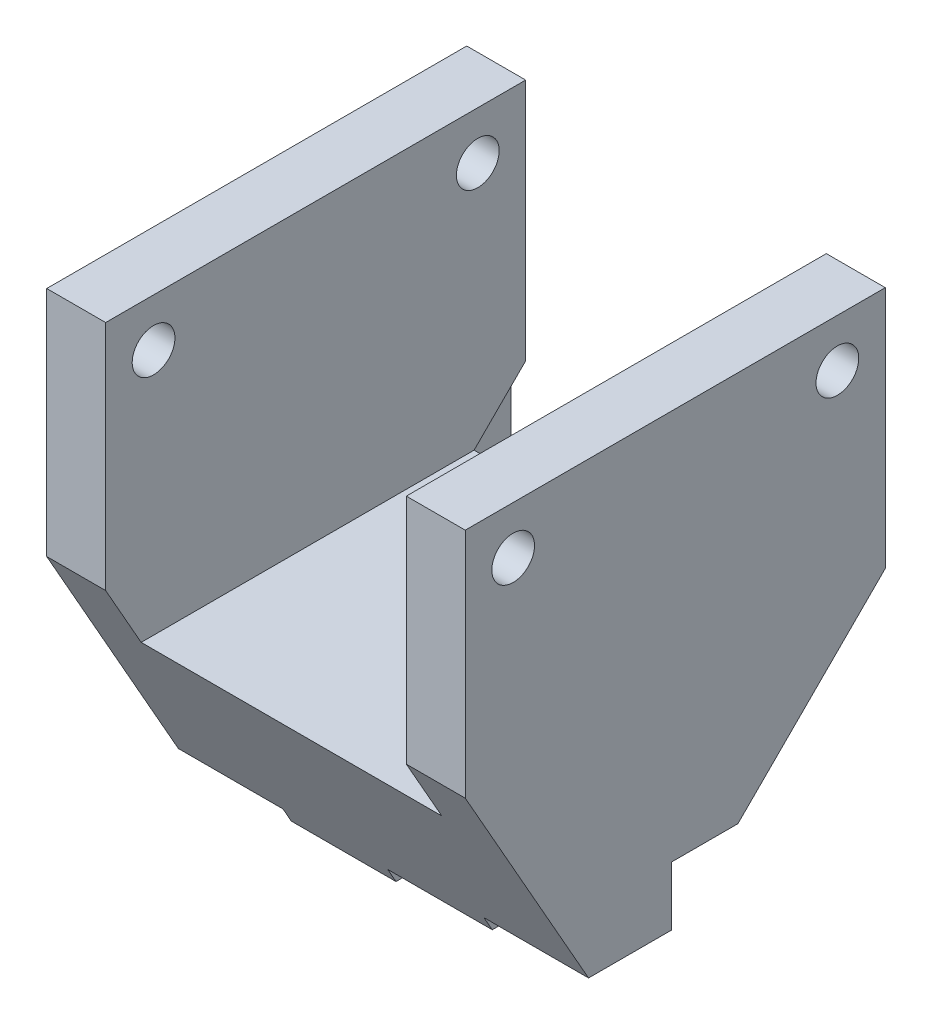
ISO-10303-21;
HEADER;
FILE_DESCRIPTION(('STEP AP214'),'2;1');
FILE_NAME('part.step','',(''),(''),'','','');
FILE_SCHEMA(('AUTOMOTIVE_DESIGN { 1 0 10303 214 1 1 1 1 }'));
ENDSEC;
DATA;
#1=APPLICATION_CONTEXT('core data for automotive mechanical design processes');
#2=APPLICATION_PROTOCOL_DEFINITION('international standard','automotive_design',2000,#1);
#3=PRODUCT_CONTEXT('',#1,'mechanical');
#4=PRODUCT('Part','Part','',(#3));
#5=PRODUCT_RELATED_PRODUCT_CATEGORY('part','',(#4));
#6=PRODUCT_DEFINITION_FORMATION('','',#4);
#7=PRODUCT_DEFINITION_CONTEXT('part definition',#1,'design');
#8=PRODUCT_DEFINITION('design','',#6,#7);
#9=PRODUCT_DEFINITION_SHAPE('','',#8);
#10=(LENGTH_UNIT() NAMED_UNIT(*) SI_UNIT(.MILLI.,.METRE.));
#11=(NAMED_UNIT(*) PLANE_ANGLE_UNIT() SI_UNIT($,.RADIAN.));
#12=(NAMED_UNIT(*) SI_UNIT($,.STERADIAN.) SOLID_ANGLE_UNIT());
#13=UNCERTAINTY_MEASURE_WITH_UNIT(LENGTH_MEASURE(1.E-05),#10,'distance_accuracy_value','');
#14=(GEOMETRIC_REPRESENTATION_CONTEXT(3) GLOBAL_UNCERTAINTY_ASSIGNED_CONTEXT((#13)) GLOBAL_UNIT_ASSIGNED_CONTEXT((#10,
#11,#12)) REPRESENTATION_CONTEXT('',''));
#15=CARTESIAN_POINT('',(0.,0.,0.));
#16=DIRECTION('',(0.,0.,1.));
#17=DIRECTION('',(1.,0.,0.));
#18=AXIS2_PLACEMENT_3D('',#15,#16,#17);
#19=CARTESIAN_POINT('',(64.,0.,0.));
#20=DIRECTION('',(0.,0.,1.));
#21=DIRECTION('',(-1.,0.,0.));
#22=AXIS2_PLACEMENT_3D('',#19,#20,#21);
#23=PLANE('',#22);
#24=DIRECTION('',(0.,1.,0.));
#25=VECTOR('',#24,1.);
#26=CARTESIAN_POINT('',(50.,4.74999999999999,0.));
#27=LINE('',#26,#25);
#28=CARTESIAN_POINT('',(50.,-7.25000000000001,0.));
#29=VERTEX_POINT('',#28);
#30=CARTESIAN_POINT('',(50.,6.75000000000007,0.));
#31=VERTEX_POINT('',#30);
#32=EDGE_CURVE('E470',#29,#31,#27,.T.);
#33=ORIENTED_EDGE('',*,*,#32,.F.);
#34=DIRECTION('',(-1.,0.,0.));
#35=VECTOR('',#34,1.);
#36=CARTESIAN_POINT('',(75.4,-7.25000000000001,0.));
#37=LINE('',#36,#35);
#38=CARTESIAN_POINT('',(47.,-7.25000000000001,0.));
#39=VERTEX_POINT('',#38);
#40=EDGE_CURVE('E259',#29,#39,#37,.T.);
#41=ORIENTED_EDGE('',*,*,#40,.T.);
#42=CARTESIAN_POINT('',(47.,-2.25000000000001,0.));
#43=DIRECTION('',(0.,0.,-1.));
#44=DIRECTION('',(-1.,0.,0.));
#45=AXIS2_PLACEMENT_3D('',#42,#43,#44);
#46=CIRCLE('',#45,5.);
#47=CARTESIAN_POINT('',(42.,-2.25000000000001,0.));
#48=VERTEX_POINT('',#47);
#49=EDGE_CURVE('E557',#48,#39,#46,.F.);
#50=ORIENTED_EDGE('',*,*,#49,.F.);
#51=DIRECTION('',(0.,1.,0.));
#52=VECTOR('',#51,1.);
#53=CARTESIAN_POINT('',(42.,4.74999999999999,0.));
#54=LINE('',#53,#52);
#55=CARTESIAN_POINT('',(42.,4.74999999999999,0.));
#56=VERTEX_POINT('',#55);
#57=EDGE_CURVE('E459',#48,#56,#54,.T.);
#58=ORIENTED_EDGE('',*,*,#57,.T.);
#59=DIRECTION('',(-1.,0.,0.));
#60=VECTOR('',#59,1.);
#61=CARTESIAN_POINT('',(50.,4.74999999999999,0.));
#62=LINE('',#61,#60);
#63=CARTESIAN_POINT('',(47.,4.75,0.));
#64=VERTEX_POINT('',#63);
#65=EDGE_CURVE('E473',#64,#56,#62,.T.);
#66=ORIENTED_EDGE('',*,*,#65,.F.);
#67=DIRECTION('',(0.,1.,0.));
#68=VECTOR('',#67,1.);
#69=CARTESIAN_POINT('',(47.,23.25,0.));
#70=LINE('',#69,#68);
#71=CARTESIAN_POINT('',(47.,23.25,0.));
#72=VERTEX_POINT('',#71);
#73=EDGE_CURVE('E520',#64,#72,#70,.T.);
#74=ORIENTED_EDGE('',*,*,#73,.T.);
#75=DIRECTION('',(1.,0.,0.));
#76=VECTOR('',#75,1.);
#77=CARTESIAN_POINT('',(81.,23.25,0.));
#78=LINE('',#77,#76);
#79=CARTESIAN_POINT('',(51.,23.25,0.));
#80=VERTEX_POINT('',#79);
#81=EDGE_CURVE('E526',#72,#80,#78,.T.);
#82=ORIENTED_EDGE('',*,*,#81,.T.);
#83=DIRECTION('',(0.,-1.,0.));
#84=VECTOR('',#83,1.);
#85=CARTESIAN_POINT('',(51.,23.25,0.));
#86=LINE('',#85,#84);
#87=CARTESIAN_POINT('',(51.,6.75000000000007,0.));
#88=VERTEX_POINT('',#87);
#89=EDGE_CURVE('E488',#80,#88,#86,.T.);
#90=ORIENTED_EDGE('',*,*,#89,.T.);
#91=DIRECTION('',(1.,0.,0.));
#92=VECTOR('',#91,1.);
#93=CARTESIAN_POINT('',(64.,6.75000000000006,0.));
#94=LINE('',#93,#92);
#95=EDGE_CURVE('E573',#31,#88,#94,.T.);
#96=ORIENTED_EDGE('',*,*,#95,.F.);
#97=EDGE_LOOP('',(#33,#41,#50,#58,#66,#74,#82,#90,#96));
#98=FACE_BOUND('',#97,.T.);
#99=ADVANCED_FACE('F49',(#98),#23,.F.);
#100=CARTESIAN_POINT('',(81.,-3.25000000000001,28.5));
#101=DIRECTION('',(0.,1.,0.));
#102=DIRECTION('',(1.,0.,0.));
#103=AXIS2_PLACEMENT_3D('',#100,#101,#102);
#104=PLANE('',#103);
#105=DIRECTION('',(0.,0.,-1.));
#106=VECTOR('',#105,1.);
#107=CARTESIAN_POINT('',(75.4,-3.25000000000001,28.5));
#108=LINE('',#107,#106);
#109=CARTESIAN_POINT('',(75.4,-3.25000000000001,14.5));
#110=VERTEX_POINT('',#109);
#111=CARTESIAN_POINT('',(75.4,-3.25000000000001,10.0000000000002));
#112=VERTEX_POINT('',#111);
#113=EDGE_CURVE('E420',#110,#112,#108,.T.);
#114=ORIENTED_EDGE('',*,*,#113,.F.);
#115=DIRECTION('',(-1.,0.,0.));
#116=VECTOR('',#115,1.);
#117=CARTESIAN_POINT('',(64.,-3.25000000000001,14.5));
#118=LINE('',#117,#116);
#119=CARTESIAN_POINT('',(68.3,-3.25000000000001,14.5));
#120=VERTEX_POINT('',#119);
#121=EDGE_CURVE('E358',#110,#120,#118,.T.);
#122=ORIENTED_EDGE('',*,*,#121,.T.);
#123=DIRECTION('',(0.,0.,-1.));
#124=VECTOR('',#123,1.);
#125=CARTESIAN_POINT('',(68.3,-3.25000000000001,0.));
#126=LINE('',#125,#124);
#127=CARTESIAN_POINT('',(68.3,-3.25000000000001,11.5));
#128=VERTEX_POINT('',#127);
#129=EDGE_CURVE('E374',#120,#128,#126,.T.);
#130=ORIENTED_EDGE('',*,*,#129,.T.);
#131=DIRECTION('',(-1.,0.,0.));
#132=VECTOR('',#131,1.);
#133=CARTESIAN_POINT('',(64.,-3.25000000000001,11.5));
#134=LINE('',#133,#132);
#135=CARTESIAN_POINT('',(61.2,-3.25000000000001,11.5));
#136=VERTEX_POINT('',#135);
#137=EDGE_CURVE('E378',#128,#136,#134,.T.);
#138=ORIENTED_EDGE('',*,*,#137,.T.);
#139=DIRECTION('',(0.,0.,-1.));
#140=VECTOR('',#139,1.);
#141=CARTESIAN_POINT('',(61.2,-3.25000000000001,0.));
#142=LINE('',#141,#140);
#143=CARTESIAN_POINT('',(61.2,-3.25000000000001,10.0000000000002));
#144=VERTEX_POINT('',#143);
#145=EDGE_CURVE('E382',#136,#144,#142,.T.);
#146=ORIENTED_EDGE('',*,*,#145,.T.);
#147=DIRECTION('',(-1.,0.,0.));
#148=VECTOR('',#147,1.);
#149=CARTESIAN_POINT('',(81.,-3.25000000000001,10.0000000000002));
#150=LINE('',#149,#148);
#151=EDGE_CURVE('E565',#112,#144,#150,.T.);
#152=ORIENTED_EDGE('',*,*,#151,.F.);
#153=EDGE_LOOP('',(#114,#122,#130,#138,#146,#152));
#154=FACE_BOUND('',#153,.T.);
#155=ADVANCED_FACE('F660',(#154),#104,.F.);
#156=CARTESIAN_POINT('',(64.,0.,28.5));
#157=DIRECTION('',(0.,0.,1.));
#158=DIRECTION('',(-1.,0.,0.));
#159=AXIS2_PLACEMENT_3D('',#156,#157,#158);
#160=PLANE('',#159);
#161=DIRECTION('',(-1.,0.,0.));
#162=VECTOR('',#161,1.);
#163=CARTESIAN_POINT('',(75.4,7.49999999999999,28.5));
#164=LINE('',#163,#162);
#165=CARTESIAN_POINT('',(51.,7.49999999999999,28.5));
#166=VERTEX_POINT('',#165);
#167=CARTESIAN_POINT('',(47.,7.49999999999999,28.5));
#168=VERTEX_POINT('',#167);
#169=EDGE_CURVE('E278',#166,#168,#164,.T.);
#170=ORIENTED_EDGE('',*,*,#169,.F.);
#171=DIRECTION('',(0.,-1.,0.));
#172=VECTOR('',#171,1.);
#173=CARTESIAN_POINT('',(51.,23.25,28.5));
#174=LINE('',#173,#172);
#175=CARTESIAN_POINT('',(51.,23.25,28.5));
#176=VERTEX_POINT('',#175);
#177=EDGE_CURVE('E489',#176,#166,#174,.T.);
#178=ORIENTED_EDGE('',*,*,#177,.F.);
#179=DIRECTION('',(1.,0.,0.));
#180=VECTOR('',#179,1.);
#181=CARTESIAN_POINT('',(81.,23.25,28.5));
#182=LINE('',#181,#180);
#183=CARTESIAN_POINT('',(47.,23.25,28.5));
#184=VERTEX_POINT('',#183);
#185=EDGE_CURVE('E527',#184,#176,#182,.T.);
#186=ORIENTED_EDGE('',*,*,#185,.F.);
#187=DIRECTION('',(0.,1.,0.));
#188=VECTOR('',#187,1.);
#189=CARTESIAN_POINT('',(47.,23.25,28.5));
#190=LINE('',#189,#188);
#191=EDGE_CURVE('E521',#168,#184,#190,.T.);
#192=ORIENTED_EDGE('',*,*,#191,.F.);
#193=EDGE_LOOP('',(#170,#178,#186,#192));
#194=FACE_BOUND('',#193,.T.);
#195=ADVANCED_FACE('F650',(#194),#160,.T.);
#196=CARTESIAN_POINT('',(54.1,-7.25000000000001,0.));
#197=DIRECTION('',(-1.,0.,0.));
#198=DIRECTION('',(0.,0.,-1.));
#199=AXIS2_PLACEMENT_3D('',#196,#197,#198);
#200=PLANE('',#199);
#201=DIRECTION('',(0.,0.869836501992695,0.493340105607797));
#202=VECTOR('',#201,1.);
#203=CARTESIAN_POINT('',(54.1,-15.8901483229395,15.2339457272881));
#204=LINE('',#203,#202);
#205=CARTESIAN_POINT('',(54.1,-9.25000000000001,19.));
#206=VERTEX_POINT('',#205);
#207=CARTESIAN_POINT('',(54.1,-8.25000000000001,19.5671641791045));
#208=VERTEX_POINT('',#207);
#209=EDGE_CURVE('E283',#206,#208,#204,.T.);
#210=ORIENTED_EDGE('',*,*,#209,.T.);
#211=DIRECTION('',(0.,0.,-1.));
#212=VECTOR('',#211,1.);
#213=CARTESIAN_POINT('',(54.1,-8.25000000000001,28.5));
#214=LINE('',#213,#212);
#215=CARTESIAN_POINT('',(54.1,-8.25000000000001,11.6031489752996));
#216=VERTEX_POINT('',#215);
#217=EDGE_CURVE('E323',#208,#216,#214,.T.);
#218=ORIENTED_EDGE('',*,*,#217,.T.);
#219=DIRECTION('',(0.,1.,0.));
#220=VECTOR('',#219,1.);
#221=CARTESIAN_POINT('',(54.1,-7.25000000000001,11.6031489752996));
#222=LINE('',#221,#220);
#223=CARTESIAN_POINT('',(54.1,-3.25000000000001,11.6031489752996));
#224=VERTEX_POINT('',#223);
#225=EDGE_CURVE('E397',#216,#224,#222,.T.);
#226=ORIENTED_EDGE('',*,*,#225,.T.);
#227=DIRECTION('',(0.,0.,-1.));
#228=VECTOR('',#227,1.);
#229=CARTESIAN_POINT('',(54.1,-3.25000000000001,0.));
#230=LINE('',#229,#228);
#231=CARTESIAN_POINT('',(54.1,-3.25000000000001,10.0000000000002));
#232=VERTEX_POINT('',#231);
#233=EDGE_CURVE('E386',#224,#232,#230,.T.);
#234=ORIENTED_EDGE('',*,*,#233,.T.);
#235=DIRECTION('',(0.,0.707106781186544,-0.707106781186551));
#236=VECTOR('',#235,1.);
#237=CARTESIAN_POINT('',(54.1,-3.25000000000001,10.0000000000002));
#238=LINE('',#237,#236);
#239=CARTESIAN_POINT('',(54.1,-2.74999999999984,9.5));
#240=VERTEX_POINT('',#239);
#241=EDGE_CURVE('E600',#240,#232,#238,.F.);
#242=ORIENTED_EDGE('',*,*,#241,.F.);
#243=DIRECTION('',(0.,1.,0.));
#244=VECTOR('',#243,1.);
#245=CARTESIAN_POINT('',(54.1,-7.25000000000001,9.5));
#246=LINE('',#245,#244);
#247=CARTESIAN_POINT('',(54.1,-9.25000000000001,9.5));
#248=VERTEX_POINT('',#247);
#249=EDGE_CURVE('E401',#248,#240,#246,.T.);
#250=ORIENTED_EDGE('',*,*,#249,.F.);
#251=DIRECTION('',(0.,0.,1.));
#252=VECTOR('',#251,1.);
#253=CARTESIAN_POINT('',(54.1,-9.25000000000001,9.5));
#254=LINE('',#253,#252);
#255=EDGE_CURVE('E334',#248,#206,#254,.T.);
#256=ORIENTED_EDGE('',*,*,#255,.T.);
#257=EDGE_LOOP('',(#210,#218,#226,#234,#242,#250,#256));
#258=FACE_BOUND('',#257,.T.);
#259=ADVANCED_FACE('F744',(#258),#200,.T.);
#260=CARTESIAN_POINT('',(64.,-7.25000000000001,0.));
#261=DIRECTION('',(0.,-1.,0.));
#262=DIRECTION('',(-1.,0.,0.));
#263=AXIS2_PLACEMENT_3D('',#260,#261,#262);
#264=PLANE('',#263);
#265=DIRECTION('',(-1.,0.,0.));
#266=VECTOR('',#265,1.);
#267=CARTESIAN_POINT('',(64.,-7.25000000000001,20.134328358209));
#268=LINE('',#267,#266);
#269=CARTESIAN_POINT('',(75.4,-7.25000000000001,20.134328358209));
#270=VERTEX_POINT('',#269);
#271=CARTESIAN_POINT('',(68.3,-7.25000000000001,20.134328358209));
#272=VERTEX_POINT('',#271);
#273=EDGE_CURVE('E253',#270,#272,#268,.T.);
#274=ORIENTED_EDGE('',*,*,#273,.T.);
#275=DIRECTION('',(0.,0.,-1.));
#276=VECTOR('',#275,1.);
#277=CARTESIAN_POINT('',(68.3,-7.25000000000001,11.5));
#278=LINE('',#277,#276);
#279=CARTESIAN_POINT('',(68.3,-7.25000000000001,14.5));
#280=VERTEX_POINT('',#279);
#281=EDGE_CURVE('E345',#272,#280,#278,.T.);
#282=ORIENTED_EDGE('',*,*,#281,.T.);
#283=DIRECTION('',(-1.,0.,0.));
#284=VECTOR('',#283,1.);
#285=CARTESIAN_POINT('',(64.,-7.25000000000001,14.5));
#286=LINE('',#285,#284);
#287=CARTESIAN_POINT('',(75.4,-7.25000000000001,14.5));
#288=VERTEX_POINT('',#287);
#289=EDGE_CURVE('E362',#288,#280,#286,.T.);
#290=ORIENTED_EDGE('',*,*,#289,.F.);
#291=DIRECTION('',(0.,0.,-1.));
#292=VECTOR('',#291,1.);
#293=CARTESIAN_POINT('',(75.4,-7.25000000000001,0.));
#294=LINE('',#293,#292);
#295=EDGE_CURVE('E366',#270,#288,#294,.T.);
#296=ORIENTED_EDGE('',*,*,#295,.F.);
#297=EDGE_LOOP('',(#274,#282,#290,#296));
#298=FACE_BOUND('',#297,.T.);
#299=ADVANCED_FACE('F741',(#298),#264,.T.);
#300=ORIENTED_EDGE('',*,*,#233,.F.);
#301=DIRECTION('',(1.,0.,0.));
#302=VECTOR('',#301,1.);
#303=CARTESIAN_POINT('',(64.,-3.25000000000001,11.6031489752996));
#304=LINE('',#303,#302);
#305=CARTESIAN_POINT('',(47.,-3.25000000000001,11.6031489752996));
#306=VERTEX_POINT('',#305);
#307=EDGE_CURVE('E367',#306,#224,#304,.T.);
#308=ORIENTED_EDGE('',*,*,#307,.F.);
#309=DIRECTION('',(0.,0.,1.));
#310=VECTOR('',#309,1.);
#311=CARTESIAN_POINT('',(47.,-3.25000000000001,28.5));
#312=LINE('',#311,#310);
#313=CARTESIAN_POINT('',(47.,-3.25000000000001,10.0000000000002));
#314=VERTEX_POINT('',#313);
#315=EDGE_CURVE('E508',#314,#306,#312,.T.);
#316=ORIENTED_EDGE('',*,*,#315,.F.);
#317=DIRECTION('',(-1.,0.,0.));
#318=VECTOR('',#317,1.);
#319=CARTESIAN_POINT('',(81.,-3.25000000000001,10.0000000000002));
#320=LINE('',#319,#318);
#321=EDGE_CURVE('E561',#232,#314,#320,.T.);
#322=ORIENTED_EDGE('',*,*,#321,.F.);
#323=EDGE_LOOP('',(#300,#308,#316,#322));
#324=FACE_BOUND('',#323,.T.);
#325=ADVANCED_FACE('F657',(#324),#104,.F.);
#326=CARTESIAN_POINT('',(81.,23.25,28.5));
#327=DIRECTION('',(0.,-1.,0.));
#328=DIRECTION('',(0.,0.,-1.));
#329=AXIS2_PLACEMENT_3D('',#326,#327,#328);
#330=PLANE('',#329);
#331=ORIENTED_EDGE('',*,*,#81,.F.);
#332=DIRECTION('',(0.,0.,-1.));
#333=VECTOR('',#332,1.);
#334=CARTESIAN_POINT('',(47.,23.25,28.5));
#335=LINE('',#334,#333);
#336=EDGE_CURVE('E531',#184,#72,#335,.T.);
#337=ORIENTED_EDGE('',*,*,#336,.F.);
#338=ORIENTED_EDGE('',*,*,#185,.T.);
#339=DIRECTION('',(0.,0.,-1.));
#340=VECTOR('',#339,1.);
#341=CARTESIAN_POINT('',(51.,23.25,28.5));
#342=LINE('',#341,#340);
#343=EDGE_CURVE('E497',#176,#80,#342,.T.);
#344=ORIENTED_EDGE('',*,*,#343,.T.);
#345=EDGE_LOOP('',(#331,#337,#338,#344));
#346=FACE_BOUND('',#345,.T.);
#347=ADVANCED_FACE('F644',(#346),#330,.F.);
#348=CARTESIAN_POINT('',(81.,20.,25.25));
#349=DIRECTION('',(-1.,0.,0.));
#350=DIRECTION('',(0.,1.,0.));
#351=AXIS2_PLACEMENT_3D('',#348,#349,#350);
#352=CYLINDRICAL_SURFACE('',#351,1.45);
#353=CARTESIAN_POINT('',(51.,20.,25.25));
#354=DIRECTION('',(1.,0.,0.));
#355=DIRECTION('',(0.,1.,0.));
#356=AXIS2_PLACEMENT_3D('',#353,#354,#355);
#357=CIRCLE('',#356,1.45);
#358=CARTESIAN_POINT('',(51.,21.45,25.25));
#359=VERTEX_POINT('',#358);
#360=EDGE_CURVE('E504',#359,#359,#357,.F.);
#361=ORIENTED_EDGE('',*,*,#360,.F.);
#362=EDGE_LOOP('',(#361));
#363=FACE_BOUND('',#362,.T.);
#364=CARTESIAN_POINT('',(47.,20.,25.25));
#365=DIRECTION('',(1.,0.,0.));
#366=DIRECTION('',(0.,1.,0.));
#367=AXIS2_PLACEMENT_3D('',#364,#365,#366);
#368=CIRCLE('',#367,1.45);
#369=CARTESIAN_POINT('',(47.,21.45,25.25));
#370=VERTEX_POINT('',#369);
#371=EDGE_CURVE('E516',#370,#370,#368,.T.);
#372=ORIENTED_EDGE('',*,*,#371,.F.);
#373=EDGE_LOOP('',(#372));
#374=FACE_BOUND('',#373,.T.);
#375=ADVANCED_FACE('F656',(#363,#374),#352,.F.);
#376=CARTESIAN_POINT('',(81.,20.,3.25));
#377=DIRECTION('',(-1.,0.,0.));
#378=DIRECTION('',(0.,1.,0.));
#379=AXIS2_PLACEMENT_3D('',#376,#377,#378);
#380=CYLINDRICAL_SURFACE('',#379,1.45);
#381=CARTESIAN_POINT('',(51.,20.,3.25));
#382=DIRECTION('',(1.,0.,0.));
#383=DIRECTION('',(0.,1.,0.));
#384=AXIS2_PLACEMENT_3D('',#381,#382,#383);
#385=CIRCLE('',#384,1.45);
#386=CARTESIAN_POINT('',(51.,21.45,3.25));
#387=VERTEX_POINT('',#386);
#388=EDGE_CURVE('E500',#387,#387,#385,.F.);
#389=ORIENTED_EDGE('',*,*,#388,.F.);
#390=EDGE_LOOP('',(#389));
#391=FACE_BOUND('',#390,.T.);
#392=CARTESIAN_POINT('',(47.,20.,3.25));
#393=DIRECTION('',(1.,0.,0.));
#394=DIRECTION('',(0.,1.,0.));
#395=AXIS2_PLACEMENT_3D('',#392,#393,#394);
#396=CIRCLE('',#395,1.45);
#397=CARTESIAN_POINT('',(47.,21.45,3.25));
#398=VERTEX_POINT('',#397);
#399=EDGE_CURVE('E512',#398,#398,#396,.T.);
#400=ORIENTED_EDGE('',*,*,#399,.F.);
#401=EDGE_LOOP('',(#400));
#402=FACE_BOUND('',#401,.T.);
#403=ADVANCED_FACE('F651',(#391,#402),#380,.F.);
#404=CARTESIAN_POINT('',(47.,23.25,28.5));
#405=DIRECTION('',(1.,0.,0.));
#406=DIRECTION('',(0.,-1.,0.));
#407=AXIS2_PLACEMENT_3D('',#404,#405,#406);
#408=PLANE('',#407);
#409=ORIENTED_EDGE('',*,*,#399,.T.);
#410=EDGE_LOOP('',(#409));
#411=FACE_BOUND('',#410,.T.);
#412=ORIENTED_EDGE('',*,*,#371,.T.);
#413=EDGE_LOOP('',(#412));
#414=FACE_BOUND('',#413,.T.);
#415=ORIENTED_EDGE('',*,*,#315,.T.);
#416=DIRECTION('',(0.,1.,0.));
#417=VECTOR('',#416,1.);
#418=CARTESIAN_POINT('',(47.,-7.25000000000001,11.6031489752996));
#419=LINE('',#418,#417);
#420=CARTESIAN_POINT('',(47.,-8.25000000000001,11.6031489752996));
#421=VERTEX_POINT('',#420);
#422=EDGE_CURVE('E394',#421,#306,#419,.T.);
#423=ORIENTED_EDGE('',*,*,#422,.F.);
#424=DIRECTION('',(0.,0.,1.));
#425=VECTOR('',#424,1.);
#426=CARTESIAN_POINT('',(47.,-8.25000000000001,28.5));
#427=LINE('',#426,#425);
#428=CARTESIAN_POINT('',(47.,-8.25000000000001,19.5671641791045));
#429=VERTEX_POINT('',#428);
#430=EDGE_CURVE('E330',#421,#429,#427,.T.);
#431=ORIENTED_EDGE('',*,*,#430,.T.);
#432=DIRECTION('',(0.,-0.869836501992695,-0.493340105607797));
#433=VECTOR('',#432,1.);
#434=CARTESIAN_POINT('',(47.,19.4166947581325,35.2587224001348));
#435=LINE('',#434,#433);
#436=EDGE_CURVE('E277',#168,#429,#435,.T.);
#437=ORIENTED_EDGE('',*,*,#436,.F.);
#438=ORIENTED_EDGE('',*,*,#191,.T.);
#439=ORIENTED_EDGE('',*,*,#336,.T.);
#440=ORIENTED_EDGE('',*,*,#73,.F.);
#441=DIRECTION('',(0.,0.,-1.));
#442=VECTOR('',#441,1.);
#443=CARTESIAN_POINT('',(47.,4.74999999999999,28.5));
#444=LINE('',#443,#442);
#445=CARTESIAN_POINT('',(47.,4.74999999999999,7.43708277610924));
#446=VERTEX_POINT('',#445);
#447=EDGE_CURVE('E485',#446,#64,#444,.T.);
#448=ORIENTED_EDGE('',*,*,#447,.F.);
#449=DIRECTION('',(0.,1.,0.));
#450=VECTOR('',#449,1.);
#451=CARTESIAN_POINT('',(47.,23.25,7.43708277610925));
#452=LINE('',#451,#450);
#453=CARTESIAN_POINT('',(47.,-0.687082776109106,7.43708277610924));
#454=VERTEX_POINT('',#453);
#455=EDGE_CURVE('E478',#454,#446,#452,.T.);
#456=ORIENTED_EDGE('',*,*,#455,.F.);
#457=DIRECTION('',(0.,-0.707106781186544,0.707106781186551));
#458=VECTOR('',#457,1.);
#459=CARTESIAN_POINT('',(47.,-3.25000000000001,10.0000000000002));
#460=LINE('',#459,#458);
#461=EDGE_CURVE('E577',#314,#454,#460,.F.);
#462=ORIENTED_EDGE('',*,*,#461,.F.);
#463=EDGE_LOOP('',(#415,#423,#431,#437,#438,#439,#440,#448,#456,#462));
#464=FACE_BOUND('',#463,.T.);
#465=ADVANCED_FACE('F642',(#411,#414,#464),#408,.F.);
#466=CARTESIAN_POINT('',(71.4,23.25,0.));
#467=VERTEX_POINT('',#466);
#468=CARTESIAN_POINT('',(75.4,23.25,0.));
#469=VERTEX_POINT('',#468);
#470=EDGE_CURVE('E535',#467,#469,#78,.T.);
#471=ORIENTED_EDGE('',*,*,#470,.F.);
#472=DIRECTION('',(0.,0.,1.));
#473=VECTOR('',#472,1.);
#474=CARTESIAN_POINT('',(71.4,23.25,28.5));
#475=LINE('',#474,#473);
#476=CARTESIAN_POINT('',(71.4,23.25,28.5));
#477=VERTEX_POINT('',#476);
#478=EDGE_CURVE('E451',#467,#477,#475,.T.);
#479=ORIENTED_EDGE('',*,*,#478,.T.);
#480=CARTESIAN_POINT('',(75.4,23.25,28.5));
#481=VERTEX_POINT('',#480);
#482=EDGE_CURVE('E525',#477,#481,#182,.T.);
#483=ORIENTED_EDGE('',*,*,#482,.T.);
#484=DIRECTION('',(0.,0.,-1.));
#485=VECTOR('',#484,1.);
#486=CARTESIAN_POINT('',(75.4,23.25,28.5));
#487=LINE('',#486,#485);
#488=EDGE_CURVE('E266',#481,#469,#487,.T.);
#489=ORIENTED_EDGE('',*,*,#488,.T.);
#490=EDGE_LOOP('',(#471,#479,#483,#489));
#491=FACE_BOUND('',#490,.T.);
#492=ADVANCED_FACE('F638',(#491),#330,.F.);
#493=CARTESIAN_POINT('',(75.4,7.49999999999999,28.5));
#494=VERTEX_POINT('',#493);
#495=CARTESIAN_POINT('',(71.4,7.49999999999999,28.5));
#496=VERTEX_POINT('',#495);
#497=EDGE_CURVE('E251',#494,#496,#164,.T.);
#498=ORIENTED_EDGE('',*,*,#497,.F.);
#499=DIRECTION('',(0.,-1.,0.));
#500=VECTOR('',#499,1.);
#501=CARTESIAN_POINT('',(75.4,23.25,28.5));
#502=LINE('',#501,#500);
#503=EDGE_CURVE('E262',#481,#494,#502,.T.);
#504=ORIENTED_EDGE('',*,*,#503,.F.);
#505=ORIENTED_EDGE('',*,*,#482,.F.);
#506=DIRECTION('',(0.,-1.,0.));
#507=VECTOR('',#506,1.);
#508=CARTESIAN_POINT('',(71.4,23.25,28.5));
#509=LINE('',#508,#507);
#510=EDGE_CURVE('E275',#477,#496,#509,.T.);
#511=ORIENTED_EDGE('',*,*,#510,.T.);
#512=EDGE_LOOP('',(#498,#504,#505,#511));
#513=FACE_BOUND('',#512,.T.);
#514=ADVANCED_FACE('F274',(#513),#160,.T.);
#515=DIRECTION('',(0.,1.,0.));
#516=VECTOR('',#515,1.);
#517=CARTESIAN_POINT('',(71.4,23.25,0.));
#518=LINE('',#517,#516);
#519=CARTESIAN_POINT('',(71.4,6.75000000000006,0.));
#520=VERTEX_POINT('',#519);
#521=EDGE_CURVE('E448',#520,#467,#518,.T.);
#522=ORIENTED_EDGE('',*,*,#521,.T.);
#523=ORIENTED_EDGE('',*,*,#470,.T.);
#524=DIRECTION('',(0.,-1.,0.));
#525=VECTOR('',#524,1.);
#526=CARTESIAN_POINT('',(75.4,23.25,0.));
#527=LINE('',#526,#525);
#528=CARTESIAN_POINT('',(75.4,6.75000000000006,0.));
#529=VERTEX_POINT('',#528);
#530=EDGE_CURVE('E271',#469,#529,#527,.T.);
#531=ORIENTED_EDGE('',*,*,#530,.T.);
#532=DIRECTION('',(1.,0.,0.));
#533=VECTOR('',#532,1.);
#534=CARTESIAN_POINT('',(64.,6.75000000000006,0.));
#535=LINE('',#534,#533);
#536=EDGE_CURVE('E569',#520,#529,#535,.T.);
#537=ORIENTED_EDGE('',*,*,#536,.F.);
#538=EDGE_LOOP('',(#522,#523,#531,#537));
#539=FACE_BOUND('',#538,.T.);
#540=ADVANCED_FACE('F634',(#539),#23,.F.);
#541=CARTESIAN_POINT('',(75.4,20.,25.25));
#542=DIRECTION('',(1.,0.,0.));
#543=DIRECTION('',(0.,1.,0.));
#544=AXIS2_PLACEMENT_3D('',#541,#542,#543);
#545=CIRCLE('',#544,1.45);
#546=CARTESIAN_POINT('',(75.4,21.45,25.25));
#547=VERTEX_POINT('',#546);
#548=EDGE_CURVE('E430',#547,#547,#545,.F.);
#549=ORIENTED_EDGE('',*,*,#548,.F.);
#550=EDGE_LOOP('',(#549));
#551=FACE_BOUND('',#550,.T.);
#552=CARTESIAN_POINT('',(71.4,20.,25.25));
#553=DIRECTION('',(1.,0.,0.));
#554=DIRECTION('',(0.,1.,0.));
#555=AXIS2_PLACEMENT_3D('',#552,#553,#554);
#556=CIRCLE('',#555,1.45);
#557=CARTESIAN_POINT('',(71.4,21.45,25.25));
#558=VERTEX_POINT('',#557);
#559=EDGE_CURVE('E438',#558,#558,#556,.T.);
#560=ORIENTED_EDGE('',*,*,#559,.F.);
#561=EDGE_LOOP('',(#560));
#562=FACE_BOUND('',#561,.T.);
#563=ADVANCED_FACE('F667',(#551,#562),#352,.F.);
#564=CARTESIAN_POINT('',(75.4,20.,3.25));
#565=DIRECTION('',(1.,0.,0.));
#566=DIRECTION('',(0.,1.,0.));
#567=AXIS2_PLACEMENT_3D('',#564,#565,#566);
#568=CIRCLE('',#567,1.45);
#569=CARTESIAN_POINT('',(75.4,21.45,3.25));
#570=VERTEX_POINT('',#569);
#571=EDGE_CURVE('E424',#570,#570,#568,.F.);
#572=ORIENTED_EDGE('',*,*,#571,.F.);
#573=EDGE_LOOP('',(#572));
#574=FACE_BOUND('',#573,.T.);
#575=CARTESIAN_POINT('',(71.4,20.,3.25));
#576=DIRECTION('',(1.,0.,0.));
#577=DIRECTION('',(0.,1.,0.));
#578=AXIS2_PLACEMENT_3D('',#575,#576,#577);
#579=CIRCLE('',#578,1.45);
#580=CARTESIAN_POINT('',(71.4,21.45,3.25));
#581=VERTEX_POINT('',#580);
#582=EDGE_CURVE('E434',#581,#581,#579,.T.);
#583=ORIENTED_EDGE('',*,*,#582,.F.);
#584=EDGE_LOOP('',(#583));
#585=FACE_BOUND('',#584,.T.);
#586=ADVANCED_FACE('F671',(#574,#585),#380,.F.);
#587=CARTESIAN_POINT('',(51.,23.25,28.5));
#588=DIRECTION('',(-1.,0.,0.));
#589=DIRECTION('',(0.,1.,0.));
#590=AXIS2_PLACEMENT_3D('',#587,#588,#589);
#591=PLANE('',#590);
#592=ORIENTED_EDGE('',*,*,#388,.T.);
#593=EDGE_LOOP('',(#592));
#594=FACE_BOUND('',#593,.T.);
#595=ORIENTED_EDGE('',*,*,#89,.F.);
#596=ORIENTED_EDGE('',*,*,#343,.F.);
#597=ORIENTED_EDGE('',*,*,#177,.T.);
#598=DIRECTION('',(0.,0.869836501992695,0.493340105607797));
#599=VECTOR('',#598,1.);
#600=CARTESIAN_POINT('',(51.,19.4166947581325,35.2587224001348));
#601=LINE('',#600,#599);
#602=CARTESIAN_POINT('',(51.,3.24999999999999,26.089552238806));
#603=VERTEX_POINT('',#602);
#604=EDGE_CURVE('E317',#603,#166,#601,.T.);
#605=ORIENTED_EDGE('',*,*,#604,.F.);
#606=DIRECTION('',(0.,0.,-1.));
#607=VECTOR('',#606,1.);
#608=CARTESIAN_POINT('',(51.,3.24999999999999,28.5));
#609=LINE('',#608,#607);
#610=CARTESIAN_POINT('',(51.,3.24999999999999,3.50000000000011));
#611=VERTEX_POINT('',#610);
#612=EDGE_CURVE('E493',#603,#611,#609,.T.);
#613=ORIENTED_EDGE('',*,*,#612,.T.);
#614=DIRECTION('',(0.,0.707106781186544,-0.707106781186551));
#615=VECTOR('',#614,1.);
#616=CARTESIAN_POINT('',(51.,-3.25000000000001,10.0000000000002));
#617=LINE('',#616,#615);
#618=EDGE_CURVE('E581',#88,#611,#617,.F.);
#619=ORIENTED_EDGE('',*,*,#618,.F.);
#620=EDGE_LOOP('',(#595,#596,#597,#605,#613,#619));
#621=FACE_BOUND('',#620,.T.);
#622=ORIENTED_EDGE('',*,*,#360,.T.);
#623=EDGE_LOOP('',(#622));
#624=FACE_BOUND('',#623,.T.);
#625=ADVANCED_FACE('F621',(#594,#621,#624),#591,.F.);
#626=CARTESIAN_POINT('',(51.,3.24999999999999,28.5));
#627=DIRECTION('',(0.,-1.,0.));
#628=DIRECTION('',(0.,0.,-1.));
#629=AXIS2_PLACEMENT_3D('',#626,#627,#628);
#630=PLANE('',#629);
#631=ORIENTED_EDGE('',*,*,#612,.F.);
#632=DIRECTION('',(-1.,0.,0.));
#633=VECTOR('',#632,1.);
#634=CARTESIAN_POINT('',(51.,3.24999999999999,26.089552238806));
#635=LINE('',#634,#633);
#636=CARTESIAN_POINT('',(71.4,3.25,26.089552238806));
#637=VERTEX_POINT('',#636);
#638=EDGE_CURVE('E314',#637,#603,#635,.T.);
#639=ORIENTED_EDGE('',*,*,#638,.F.);
#640=DIRECTION('',(0.,0.,-1.));
#641=VECTOR('',#640,1.);
#642=CARTESIAN_POINT('',(71.4,3.25,28.5));
#643=LINE('',#642,#641);
#644=CARTESIAN_POINT('',(71.4,3.25,3.5000000000001));
#645=VERTEX_POINT('',#644);
#646=EDGE_CURVE('E444',#637,#645,#643,.T.);
#647=ORIENTED_EDGE('',*,*,#646,.T.);
#648=DIRECTION('',(-1.,0.,0.));
#649=VECTOR('',#648,1.);
#650=CARTESIAN_POINT('',(81.,3.24999999999999,3.5000000000001));
#651=LINE('',#650,#649);
#652=EDGE_CURVE('E585',#611,#645,#651,.F.);
#653=ORIENTED_EDGE('',*,*,#652,.F.);
#654=EDGE_LOOP('',(#631,#639,#647,#653));
#655=FACE_BOUND('',#654,.T.);
#656=ADVANCED_FACE('F625',(#655),#630,.F.);
#657=CARTESIAN_POINT('',(50.,4.74999999999999,7.43708277610924));
#658=DIRECTION('',(0.,1.,0.));
#659=DIRECTION('',(1.,0.,0.));
#660=AXIS2_PLACEMENT_3D('',#657,#658,#659);
#661=PLANE('',#660);
#662=ORIENTED_EDGE('',*,*,#447,.T.);
#663=ORIENTED_EDGE('',*,*,#65,.T.);
#664=DIRECTION('',(0.,0.,1.));
#665=VECTOR('',#664,1.);
#666=CARTESIAN_POINT('',(42.,4.74999999999999,7.43708277610924));
#667=LINE('',#666,#665);
#668=CARTESIAN_POINT('',(42.,4.74999999999999,7.43708277610924));
#669=VERTEX_POINT('',#668);
#670=EDGE_CURVE('E463',#56,#669,#667,.T.);
#671=ORIENTED_EDGE('',*,*,#670,.T.);
#672=DIRECTION('',(-1.,0.,0.));
#673=VECTOR('',#672,1.);
#674=CARTESIAN_POINT('',(50.,4.74999999999999,7.43708277610924));
#675=LINE('',#674,#673);
#676=EDGE_CURVE('E474',#446,#669,#675,.T.);
#677=ORIENTED_EDGE('',*,*,#676,.F.);
#678=EDGE_LOOP('',(#662,#663,#671,#677));
#679=FACE_BOUND('',#678,.T.);
#680=ADVANCED_FACE('F715',(#679),#661,.T.);
#681=CARTESIAN_POINT('',(50.,4.74999999999999,7.43708277610924));
#682=DIRECTION('',(0.,0.,1.));
#683=DIRECTION('',(0.,-1.,0.));
#684=AXIS2_PLACEMENT_3D('',#681,#682,#683);
#685=PLANE('',#684);
#686=DIRECTION('',(-1.,0.,0.));
#687=VECTOR('',#686,1.);
#688=CARTESIAN_POINT('',(75.4,-7.25000000000001,7.43708277610924));
#689=LINE('',#688,#687);
#690=CARTESIAN_POINT('',(50.,-7.25000000000001,7.43708277610924));
#691=VERTEX_POINT('',#690);
#692=CARTESIAN_POINT('',(47.,-7.25000000000001,7.43708277610924));
#693=VERTEX_POINT('',#692);
#694=EDGE_CURVE('E292',#691,#693,#689,.T.);
#695=ORIENTED_EDGE('',*,*,#694,.F.);
#696=DIRECTION('',(0.,-1.,0.));
#697=VECTOR('',#696,1.);
#698=CARTESIAN_POINT('',(50.,4.74999999999999,7.43708277610924));
#699=LINE('',#698,#697);
#700=CARTESIAN_POINT('',(50.,-0.687082776109102,7.43708277610924));
#701=VERTEX_POINT('',#700);
#702=EDGE_CURVE('E467',#701,#691,#699,.T.);
#703=ORIENTED_EDGE('',*,*,#702,.F.);
#704=DIRECTION('',(-1.,0.,0.));
#705=VECTOR('',#704,1.);
#706=CARTESIAN_POINT('',(81.,-0.687082776109107,7.43708277610924));
#707=LINE('',#706,#705);
#708=EDGE_CURVE('E58',#454,#701,#707,.F.);
#709=ORIENTED_EDGE('',*,*,#708,.F.);
#710=ORIENTED_EDGE('',*,*,#455,.T.);
#711=ORIENTED_EDGE('',*,*,#676,.T.);
#712=DIRECTION('',(0.,-1.,0.));
#713=VECTOR('',#712,1.);
#714=CARTESIAN_POINT('',(42.,4.74999999999999,7.43708277610924));
#715=LINE('',#714,#713);
#716=CARTESIAN_POINT('',(42.,-2.25000000000001,7.43708277610924));
#717=VERTEX_POINT('',#716);
#718=EDGE_CURVE('E455',#669,#717,#715,.T.);
#719=ORIENTED_EDGE('',*,*,#718,.T.);
#720=CARTESIAN_POINT('',(47.,-2.25000000000001,7.43708277610924));
#721=DIRECTION('',(0.,0.,-1.));
#722=DIRECTION('',(0.,-1.,0.));
#723=AXIS2_PLACEMENT_3D('',#720,#721,#722);
#724=CIRCLE('',#723,5.);
#725=EDGE_CURVE('E550',#693,#717,#724,.T.);
#726=ORIENTED_EDGE('',*,*,#725,.F.);
#727=EDGE_LOOP('',(#695,#703,#709,#710,#711,#719,#726));
#728=FACE_BOUND('',#727,.T.);
#729=ADVANCED_FACE('F608',(#728),#685,.T.);
#730=CARTESIAN_POINT('',(50.,0.,0.));
#731=DIRECTION('',(-1.,0.,0.));
#732=DIRECTION('',(0.,0.,-1.));
#733=AXIS2_PLACEMENT_3D('',#730,#731,#732);
#734=PLANE('',#733);
#735=ORIENTED_EDGE('',*,*,#32,.T.);
#736=DIRECTION('',(0.,-0.707106781186544,0.707106781186551));
#737=VECTOR('',#736,1.);
#738=CARTESIAN_POINT('',(50.,3.37500000000007,3.37500000000003));
#739=LINE('',#738,#737);
#740=EDGE_CURVE('E11',#701,#31,#739,.F.);
#741=ORIENTED_EDGE('',*,*,#740,.F.);
#742=ORIENTED_EDGE('',*,*,#702,.T.);
#743=DIRECTION('',(0.,0.,1.));
#744=VECTOR('',#743,1.);
#745=CARTESIAN_POINT('',(50.,-7.25000000000001,0.));
#746=LINE('',#745,#744);
#747=EDGE_CURVE('E320',#29,#691,#746,.T.);
#748=ORIENTED_EDGE('',*,*,#747,.F.);
#749=EDGE_LOOP('',(#735,#741,#742,#748));
#750=FACE_BOUND('',#749,.T.);
#751=ADVANCED_FACE('F610',(#750),#734,.F.);
#752=CARTESIAN_POINT('',(42.,0.,0.));
#753=DIRECTION('',(-1.,0.,0.));
#754=DIRECTION('',(0.,0.,-1.));
#755=AXIS2_PLACEMENT_3D('',#752,#753,#754);
#756=PLANE('',#755);
#757=ORIENTED_EDGE('',*,*,#718,.F.);
#758=ORIENTED_EDGE('',*,*,#670,.F.);
#759=ORIENTED_EDGE('',*,*,#57,.F.);
#760=DIRECTION('',(0.,0.,1.));
#761=VECTOR('',#760,1.);
#762=CARTESIAN_POINT('',(42.,-2.25000000000001,0.));
#763=LINE('',#762,#761);
#764=EDGE_CURVE('E554',#717,#48,#763,.F.);
#765=ORIENTED_EDGE('',*,*,#764,.F.);
#766=EDGE_LOOP('',(#757,#758,#759,#765));
#767=FACE_BOUND('',#766,.T.);
#768=ADVANCED_FACE('F717',(#767),#756,.T.);
#769=CARTESIAN_POINT('',(71.4,0.,0.));
#770=DIRECTION('',(-1.,0.,0.));
#771=DIRECTION('',(0.,1.,0.));
#772=AXIS2_PLACEMENT_3D('',#769,#770,#771);
#773=PLANE('',#772);
#774=ORIENTED_EDGE('',*,*,#646,.F.);
#775=DIRECTION('',(0.,0.869836501992695,0.493340105607797));
#776=VECTOR('',#775,1.);
#777=CARTESIAN_POINT('',(71.4,-10.4046856564976,18.3451036575089));
#778=LINE('',#777,#776);
#779=EDGE_CURVE('E311',#637,#496,#778,.T.);
#780=ORIENTED_EDGE('',*,*,#779,.T.);
#781=ORIENTED_EDGE('',*,*,#510,.F.);
#782=ORIENTED_EDGE('',*,*,#478,.F.);
#783=ORIENTED_EDGE('',*,*,#521,.F.);
#784=DIRECTION('',(0.,-0.707106781186544,0.707106781186551));
#785=VECTOR('',#784,1.);
#786=CARTESIAN_POINT('',(71.4,3.37500000000007,3.37500000000003));
#787=LINE('',#786,#785);
#788=EDGE_CURVE('E589',#645,#520,#787,.F.);
#789=ORIENTED_EDGE('',*,*,#788,.F.);
#790=EDGE_LOOP('',(#774,#780,#781,#782,#783,#789));
#791=FACE_BOUND('',#790,.T.);
#792=ORIENTED_EDGE('',*,*,#559,.T.);
#793=EDGE_LOOP('',(#792));
#794=FACE_BOUND('',#793,.T.);
#795=ORIENTED_EDGE('',*,*,#582,.T.);
#796=EDGE_LOOP('',(#795));
#797=FACE_BOUND('',#796,.T.);
#798=ADVANCED_FACE('F628',(#791,#794,#797),#773,.T.);
#799=CARTESIAN_POINT('',(75.4,23.25,28.5));
#800=DIRECTION('',(-1.,0.,0.));
#801=DIRECTION('',(0.,1.,0.));
#802=AXIS2_PLACEMENT_3D('',#799,#800,#801);
#803=PLANE('',#802);
#804=ORIENTED_EDGE('',*,*,#571,.T.);
#805=EDGE_LOOP('',(#804));
#806=FACE_BOUND('',#805,.T.);
#807=ORIENTED_EDGE('',*,*,#530,.F.);
#808=ORIENTED_EDGE('',*,*,#488,.F.);
#809=ORIENTED_EDGE('',*,*,#503,.T.);
#810=DIRECTION('',(0.,0.869836501992695,0.493340105607797));
#811=VECTOR('',#810,1.);
#812=CARTESIAN_POINT('',(75.4,-9.25000000000001,19.));
#813=LINE('',#812,#811);
#814=EDGE_CURVE('E247',#270,#494,#813,.T.);
#815=ORIENTED_EDGE('',*,*,#814,.F.);
#816=ORIENTED_EDGE('',*,*,#295,.T.);
#817=DIRECTION('',(0.,1.,0.));
#818=VECTOR('',#817,1.);
#819=CARTESIAN_POINT('',(75.4,-7.25000000000001,14.5));
#820=LINE('',#819,#818);
#821=EDGE_CURVE('E370',#288,#110,#820,.T.);
#822=ORIENTED_EDGE('',*,*,#821,.T.);
#823=ORIENTED_EDGE('',*,*,#113,.T.);
#824=DIRECTION('',(0.,0.707106781186544,-0.707106781186551));
#825=VECTOR('',#824,1.);
#826=CARTESIAN_POINT('',(75.4,-3.25000000000001,10.0000000000002));
#827=LINE('',#826,#825);
#828=EDGE_CURVE('E592',#529,#112,#827,.F.);
#829=ORIENTED_EDGE('',*,*,#828,.F.);
#830=EDGE_LOOP('',(#807,#808,#809,#815,#816,#822,#823,#829));
#831=FACE_BOUND('',#830,.T.);
#832=ORIENTED_EDGE('',*,*,#548,.T.);
#833=EDGE_LOOP('',(#832));
#834=FACE_BOUND('',#833,.T.);
#835=ADVANCED_FACE('F263',(#806,#831,#834),#803,.F.);
#836=CARTESIAN_POINT('',(64.,-7.25000000000001,14.5));
#837=DIRECTION('',(0.,0.,1.));
#838=DIRECTION('',(-1.,0.,0.));
#839=AXIS2_PLACEMENT_3D('',#836,#837,#838);
#840=PLANE('',#839);
#841=ORIENTED_EDGE('',*,*,#121,.F.);
#842=ORIENTED_EDGE('',*,*,#821,.F.);
#843=ORIENTED_EDGE('',*,*,#289,.T.);
#844=DIRECTION('',(0.,1.,0.));
#845=VECTOR('',#844,1.);
#846=CARTESIAN_POINT('',(68.3,-7.25000000000001,14.5));
#847=LINE('',#846,#845);
#848=EDGE_CURVE('E414',#280,#120,#847,.T.);
#849=ORIENTED_EDGE('',*,*,#848,.T.);
#850=EDGE_LOOP('',(#841,#842,#843,#849));
#851=FACE_BOUND('',#850,.T.);
#852=ADVANCED_FACE('F766',(#851),#840,.F.);
#853=CARTESIAN_POINT('',(68.3,-7.25000000000001,0.));
#854=DIRECTION('',(-1.,0.,0.));
#855=DIRECTION('',(0.,0.,-1.));
#856=AXIS2_PLACEMENT_3D('',#853,#854,#855);
#857=PLANE('',#856);
#858=DIRECTION('',(0.,0.,-1.));
#859=VECTOR('',#858,1.);
#860=CARTESIAN_POINT('',(68.3,-8.25000000000001,11.5));
#861=LINE('',#860,#859);
#862=CARTESIAN_POINT('',(68.3,-8.25000000000001,19.5671641791045));
#863=VERTEX_POINT('',#862);
#864=CARTESIAN_POINT('',(68.3,-8.25000000000001,11.5));
#865=VERTEX_POINT('',#864);
#866=EDGE_CURVE('E346',#863,#865,#861,.T.);
#867=ORIENTED_EDGE('',*,*,#866,.T.);
#868=DIRECTION('',(0.,1.,0.));
#869=VECTOR('',#868,1.);
#870=CARTESIAN_POINT('',(68.3,-7.25000000000001,11.5));
#871=LINE('',#870,#869);
#872=EDGE_CURVE('E411',#865,#128,#871,.T.);
#873=ORIENTED_EDGE('',*,*,#872,.T.);
#874=ORIENTED_EDGE('',*,*,#129,.F.);
#875=ORIENTED_EDGE('',*,*,#848,.F.);
#876=ORIENTED_EDGE('',*,*,#281,.F.);
#877=DIRECTION('',(0.,0.869836501992695,0.493340105607797));
#878=VECTOR('',#877,1.);
#879=CARTESIAN_POINT('',(68.3,-15.8901483229395,15.2339457272881));
#880=LINE('',#879,#878);
#881=EDGE_CURVE('E306',#863,#272,#880,.T.);
#882=ORIENTED_EDGE('',*,*,#881,.F.);
#883=EDGE_LOOP('',(#867,#873,#874,#875,#876,#882));
#884=FACE_BOUND('',#883,.T.);
#885=ADVANCED_FACE('F762',(#884),#857,.F.);
#886=CARTESIAN_POINT('',(64.,-7.25000000000001,11.5));
#887=DIRECTION('',(0.,0.,1.));
#888=DIRECTION('',(-1.,0.,0.));
#889=AXIS2_PLACEMENT_3D('',#886,#887,#888);
#890=PLANE('',#889);
#891=ORIENTED_EDGE('',*,*,#137,.F.);
#892=ORIENTED_EDGE('',*,*,#872,.F.);
#893=DIRECTION('',(-1.,0.,0.));
#894=VECTOR('',#893,1.);
#895=CARTESIAN_POINT('',(68.3,-8.25000000000001,11.5));
#896=LINE('',#895,#894);
#897=CARTESIAN_POINT('',(61.2,-8.25000000000001,11.5));
#898=VERTEX_POINT('',#897);
#899=EDGE_CURVE('E350',#865,#898,#896,.T.);
#900=ORIENTED_EDGE('',*,*,#899,.T.);
#901=DIRECTION('',(0.,1.,0.));
#902=VECTOR('',#901,1.);
#903=CARTESIAN_POINT('',(61.2,-7.25000000000001,11.5));
#904=LINE('',#903,#902);
#905=EDGE_CURVE('E408',#898,#136,#904,.T.);
#906=ORIENTED_EDGE('',*,*,#905,.T.);
#907=EDGE_LOOP('',(#891,#892,#900,#906));
#908=FACE_BOUND('',#907,.T.);
#909=ADVANCED_FACE('F758',(#908),#890,.F.);
#910=CARTESIAN_POINT('',(61.2,-7.25000000000001,0.));
#911=DIRECTION('',(-1.,0.,0.));
#912=DIRECTION('',(0.,0.,-1.));
#913=AXIS2_PLACEMENT_3D('',#910,#911,#912);
#914=PLANE('',#913);
#915=DIRECTION('',(0.,0.,-1.));
#916=VECTOR('',#915,1.);
#917=CARTESIAN_POINT('',(61.2,-9.25000000000001,9.5));
#918=LINE('',#917,#916);
#919=CARTESIAN_POINT('',(61.2,-9.25000000000001,19.));
#920=VERTEX_POINT('',#919);
#921=CARTESIAN_POINT('',(61.2,-9.25000000000001,9.5));
#922=VERTEX_POINT('',#921);
#923=EDGE_CURVE('E338',#920,#922,#918,.T.);
#924=ORIENTED_EDGE('',*,*,#923,.T.);
#925=DIRECTION('',(0.,1.,0.));
#926=VECTOR('',#925,1.);
#927=CARTESIAN_POINT('',(61.2,-7.25000000000001,9.5));
#928=LINE('',#927,#926);
#929=CARTESIAN_POINT('',(61.2,-2.74999999999984,9.5));
#930=VERTEX_POINT('',#929);
#931=EDGE_CURVE('E404',#922,#930,#928,.T.);
#932=ORIENTED_EDGE('',*,*,#931,.T.);
#933=DIRECTION('',(0.,-0.707106781186544,0.707106781186551));
#934=VECTOR('',#933,1.);
#935=CARTESIAN_POINT('',(61.2,-0.249999999999902,7.00000000000004));
#936=LINE('',#935,#934);
#937=EDGE_CURVE('E595',#144,#930,#936,.F.);
#938=ORIENTED_EDGE('',*,*,#937,.F.);
#939=ORIENTED_EDGE('',*,*,#145,.F.);
#940=ORIENTED_EDGE('',*,*,#905,.F.);
#941=DIRECTION('',(0.,0.,1.));
#942=VECTOR('',#941,1.);
#943=CARTESIAN_POINT('',(61.2,-8.25000000000001,11.5));
#944=LINE('',#943,#942);
#945=CARTESIAN_POINT('',(61.2,-8.25000000000001,19.5671641791045));
#946=VERTEX_POINT('',#945);
#947=EDGE_CURVE('E354',#898,#946,#944,.T.);
#948=ORIENTED_EDGE('',*,*,#947,.T.);
#949=DIRECTION('',(0.,0.869836501992695,0.493340105607797));
#950=VECTOR('',#949,1.);
#951=CARTESIAN_POINT('',(61.2,-15.8901483229395,15.2339457272881));
#952=LINE('',#951,#950);
#953=EDGE_CURVE('E302',#920,#946,#952,.T.);
#954=ORIENTED_EDGE('',*,*,#953,.F.);
#955=EDGE_LOOP('',(#924,#932,#938,#939,#940,#948,#954));
#956=FACE_BOUND('',#955,.T.);
#957=ADVANCED_FACE('F754',(#956),#914,.F.);
#958=CARTESIAN_POINT('',(64.,-7.25000000000001,9.5));
#959=DIRECTION('',(0.,0.,1.));
#960=DIRECTION('',(-1.,0.,0.));
#961=AXIS2_PLACEMENT_3D('',#958,#959,#960);
#962=PLANE('',#961);
#963=ORIENTED_EDGE('',*,*,#931,.F.);
#964=DIRECTION('',(-1.,0.,0.));
#965=VECTOR('',#964,1.);
#966=CARTESIAN_POINT('',(54.1,-9.25000000000001,9.5));
#967=LINE('',#966,#965);
#968=EDGE_CURVE('E342',#922,#248,#967,.T.);
#969=ORIENTED_EDGE('',*,*,#968,.T.);
#970=ORIENTED_EDGE('',*,*,#249,.T.);
#971=DIRECTION('',(1.,0.,0.));
#972=VECTOR('',#971,1.);
#973=CARTESIAN_POINT('',(64.,-2.74999999999984,9.5));
#974=LINE('',#973,#972);
#975=EDGE_CURVE('E71',#930,#240,#974,.F.);
#976=ORIENTED_EDGE('',*,*,#975,.F.);
#977=EDGE_LOOP('',(#963,#969,#970,#976));
#978=FACE_BOUND('',#977,.T.);
#979=ADVANCED_FACE('F748',(#978),#962,.F.);
#980=CARTESIAN_POINT('',(64.,-7.25000000000001,11.6031489752996));
#981=DIRECTION('',(0.,0.,-1.));
#982=DIRECTION('',(1.,0.,0.));
#983=AXIS2_PLACEMENT_3D('',#980,#981,#982);
#984=PLANE('',#983);
#985=ORIENTED_EDGE('',*,*,#307,.T.);
#986=ORIENTED_EDGE('',*,*,#225,.F.);
#987=DIRECTION('',(-1.,0.,0.));
#988=VECTOR('',#987,1.);
#989=CARTESIAN_POINT('',(54.1,-8.25000000000001,11.6031489752996));
#990=LINE('',#989,#988);
#991=EDGE_CURVE('E327',#216,#421,#990,.T.);
#992=ORIENTED_EDGE('',*,*,#991,.T.);
#993=ORIENTED_EDGE('',*,*,#422,.T.);
#994=EDGE_LOOP('',(#985,#986,#992,#993));
#995=FACE_BOUND('',#994,.T.);
#996=ADVANCED_FACE('F699',(#995),#984,.T.);
#997=CARTESIAN_POINT('',(64.,-8.25000000000001,0.));
#998=DIRECTION('',(0.,1.,0.));
#999=DIRECTION('',(1.,0.,0.));
#1000=AXIS2_PLACEMENT_3D('',#997,#998,#999);
#1001=PLANE('',#1000);
#1002=ORIENTED_EDGE('',*,*,#947,.F.);
#1003=ORIENTED_EDGE('',*,*,#899,.F.);
#1004=ORIENTED_EDGE('',*,*,#866,.F.);
#1005=DIRECTION('',(1.,0.,0.));
#1006=VECTOR('',#1005,1.);
#1007=CARTESIAN_POINT('',(64.,-8.25000000000001,19.5671641791045));
#1008=LINE('',#1007,#1006);
#1009=EDGE_CURVE('E299',#946,#863,#1008,.T.);
#1010=ORIENTED_EDGE('',*,*,#1009,.F.);
#1011=EDGE_LOOP('',(#1002,#1003,#1004,#1010));
#1012=FACE_BOUND('',#1011,.T.);
#1013=ADVANCED_FACE('F736',(#1012),#1001,.F.);
#1014=CARTESIAN_POINT('',(64.,-9.25000000000001,0.));
#1015=DIRECTION('',(0.,-1.,0.));
#1016=DIRECTION('',(-1.,0.,0.));
#1017=AXIS2_PLACEMENT_3D('',#1014,#1015,#1016);
#1018=PLANE('',#1017);
#1019=DIRECTION('',(-1.,0.,0.));
#1020=VECTOR('',#1019,1.);
#1021=CARTESIAN_POINT('',(75.4,-9.25000000000001,19.));
#1022=LINE('',#1021,#1020);
#1023=EDGE_CURVE('E258',#920,#206,#1022,.T.);
#1024=ORIENTED_EDGE('',*,*,#1023,.T.);
#1025=ORIENTED_EDGE('',*,*,#255,.F.);
#1026=ORIENTED_EDGE('',*,*,#968,.F.);
#1027=ORIENTED_EDGE('',*,*,#923,.F.);
#1028=EDGE_LOOP('',(#1024,#1025,#1026,#1027));
#1029=FACE_BOUND('',#1028,.T.);
#1030=ADVANCED_FACE('F733',(#1029),#1018,.T.);
#1031=CARTESIAN_POINT('',(64.,-8.25000000000001,0.));
#1032=DIRECTION('',(0.,-1.,0.));
#1033=DIRECTION('',(-1.,0.,0.));
#1034=AXIS2_PLACEMENT_3D('',#1031,#1032,#1033);
#1035=PLANE('',#1034);
#1036=DIRECTION('',(-1.,0.,0.));
#1037=VECTOR('',#1036,1.);
#1038=CARTESIAN_POINT('',(64.,-8.25000000000001,19.5671641791045));
#1039=LINE('',#1038,#1037);
#1040=EDGE_CURVE('E541',#208,#429,#1039,.T.);
#1041=ORIENTED_EDGE('',*,*,#1040,.T.);
#1042=ORIENTED_EDGE('',*,*,#430,.F.);
#1043=ORIENTED_EDGE('',*,*,#991,.F.);
#1044=ORIENTED_EDGE('',*,*,#217,.F.);
#1045=EDGE_LOOP('',(#1041,#1042,#1043,#1044));
#1046=FACE_BOUND('',#1045,.T.);
#1047=ADVANCED_FACE('F703',(#1046),#1035,.T.);
#1048=CARTESIAN_POINT('',(75.4,-9.25000000000001,19.));
#1049=DIRECTION('',(0.,0.493340105607797,-0.869836501992695));
#1050=DIRECTION('',(0.,0.869836501992695,0.493340105607797));
#1051=AXIS2_PLACEMENT_3D('',#1048,#1049,#1050);
#1052=PLANE('',#1051);
#1053=ORIENTED_EDGE('',*,*,#638,.T.);
#1054=ORIENTED_EDGE('',*,*,#604,.T.);
#1055=ORIENTED_EDGE('',*,*,#169,.T.);
#1056=ORIENTED_EDGE('',*,*,#436,.T.);
#1057=ORIENTED_EDGE('',*,*,#1040,.F.);
#1058=ORIENTED_EDGE('',*,*,#209,.F.);
#1059=ORIENTED_EDGE('',*,*,#1023,.F.);
#1060=ORIENTED_EDGE('',*,*,#953,.T.);
#1061=ORIENTED_EDGE('',*,*,#1009,.T.);
#1062=ORIENTED_EDGE('',*,*,#881,.T.);
#1063=ORIENTED_EDGE('',*,*,#273,.F.);
#1064=ORIENTED_EDGE('',*,*,#814,.T.);
#1065=ORIENTED_EDGE('',*,*,#497,.T.);
#1066=ORIENTED_EDGE('',*,*,#779,.F.);
#1067=EDGE_LOOP('',(#1053,#1054,#1055,#1056,#1057,#1058,#1059,#1060,#1061,#1062,#1063,#1064,
#1065,#1066));
#1068=FACE_BOUND('',#1067,.T.);
#1069=ADVANCED_FACE('F249',(#1068),#1052,.F.);
#1070=CARTESIAN_POINT('',(75.4,-7.25000000000001,7.43708277610924));
#1071=DIRECTION('',(0.,1.,0.));
#1072=DIRECTION('',(1.,0.,0.));
#1073=AXIS2_PLACEMENT_3D('',#1070,#1071,#1072);
#1074=PLANE('',#1073);
#1075=ORIENTED_EDGE('',*,*,#40,.F.);
#1076=ORIENTED_EDGE('',*,*,#747,.T.);
#1077=ORIENTED_EDGE('',*,*,#694,.T.);
#1078=DIRECTION('',(0.,0.,1.));
#1079=VECTOR('',#1078,1.);
#1080=CARTESIAN_POINT('',(47.,-7.25000000000001,7.43708277610924));
#1081=LINE('',#1080,#1079);
#1082=EDGE_CURVE('E547',#39,#693,#1081,.T.);
#1083=ORIENTED_EDGE('',*,*,#1082,.F.);
#1084=EDGE_LOOP('',(#1075,#1076,#1077,#1083));
#1085=FACE_BOUND('',#1084,.T.);
#1086=ADVANCED_FACE('F614',(#1085),#1074,.F.);
#1087=CARTESIAN_POINT('',(47.,-2.25000000000001,7.43708277610924));
#1088=DIRECTION('',(0.,0.,-1.));
#1089=DIRECTION('',(1.,0.,0.));
#1090=AXIS2_PLACEMENT_3D('',#1087,#1088,#1089);
#1091=CYLINDRICAL_SURFACE('',#1090,5.);
#1092=ORIENTED_EDGE('',*,*,#49,.T.);
#1093=ORIENTED_EDGE('',*,*,#1082,.T.);
#1094=ORIENTED_EDGE('',*,*,#725,.T.);
#1095=ORIENTED_EDGE('',*,*,#764,.T.);
#1096=EDGE_LOOP('',(#1092,#1093,#1094,#1095));
#1097=FACE_BOUND('',#1096,.T.);
#1098=ADVANCED_FACE('F719',(#1097),#1091,.T.);
#1099=CARTESIAN_POINT('',(81.,-3.25000000000001,10.0000000000002));
#1100=DIRECTION('',(0.,0.707106781186551,0.707106781186544));
#1101=DIRECTION('',(-1.,0.,0.));
#1102=AXIS2_PLACEMENT_3D('',#1099,#1100,#1101);
#1103=PLANE('',#1102);
#1104=ORIENTED_EDGE('',*,*,#618,.T.);
#1105=ORIENTED_EDGE('',*,*,#652,.T.);
#1106=ORIENTED_EDGE('',*,*,#788,.T.);
#1107=ORIENTED_EDGE('',*,*,#536,.T.);
#1108=ORIENTED_EDGE('',*,*,#828,.T.);
#1109=ORIENTED_EDGE('',*,*,#151,.T.);
#1110=ORIENTED_EDGE('',*,*,#937,.T.);
#1111=ORIENTED_EDGE('',*,*,#975,.T.);
#1112=ORIENTED_EDGE('',*,*,#241,.T.);
#1113=ORIENTED_EDGE('',*,*,#321,.T.);
#1114=ORIENTED_EDGE('',*,*,#461,.T.);
#1115=ORIENTED_EDGE('',*,*,#708,.T.);
#1116=ORIENTED_EDGE('',*,*,#740,.T.);
#1117=ORIENTED_EDGE('',*,*,#95,.T.);
#1118=EDGE_LOOP('',(#1104,#1105,#1106,#1107,#1108,#1109,#1110,#1111,#1112,#1113,#1114,#1115,
#1116,#1117));
#1119=FACE_BOUND('',#1118,.T.);
#1120=ADVANCED_FACE('F51',(#1119),#1103,.F.);
#1121=CLOSED_SHELL('',(#99,#155,#195,#259,#299,#325,#347,#375,#403,#465,#492,#514,#540,#563,
#586,#625,#656,#680,#729,#751,#768,#798,#835,#852,#885,#909,#957,#979,#996,#1013,#1030,#1047,
#1069,#1086,#1098,#1120));
#1122=MANIFOLD_SOLID_BREP('B2',#1121);
#1123=ADVANCED_BREP_SHAPE_REPRESENTATION('',(#18,#1122),#14);
#1124=SHAPE_DEFINITION_REPRESENTATION(#9,#1123);
ENDSEC;
END-ISO-10303-21;
